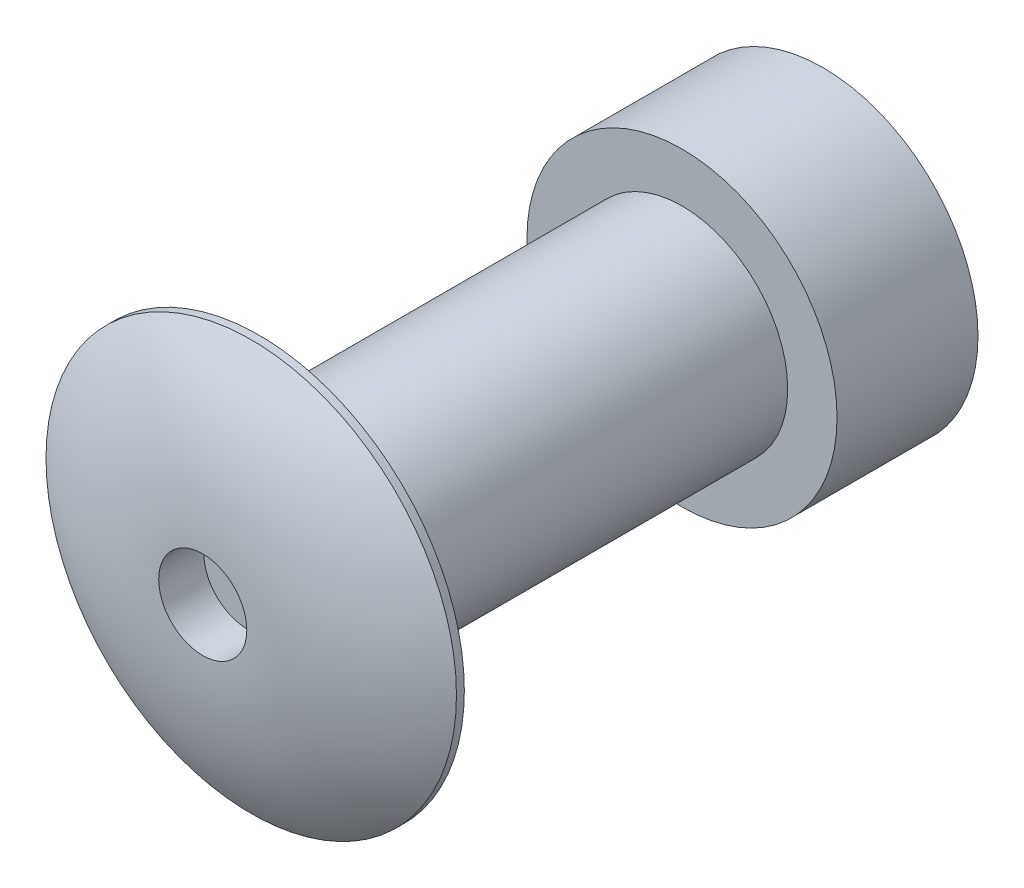
ISO-10303-21;
HEADER;
FILE_DESCRIPTION(('STEP AP214'),'2;1');
FILE_NAME('part.step','',(''),(''),'','','');
FILE_SCHEMA(('AUTOMOTIVE_DESIGN { 1 0 10303 214 1 1 1 1 }'));
ENDSEC;
DATA;
#1=APPLICATION_CONTEXT('core data for automotive mechanical design processes');
#2=APPLICATION_PROTOCOL_DEFINITION('international standard','automotive_design',2000,#1);
#3=PRODUCT_CONTEXT('',#1,'mechanical');
#4=PRODUCT('Part','Part','',(#3));
#5=PRODUCT_RELATED_PRODUCT_CATEGORY('part','',(#4));
#6=PRODUCT_DEFINITION_FORMATION('','',#4);
#7=PRODUCT_DEFINITION_CONTEXT('part definition',#1,'design');
#8=PRODUCT_DEFINITION('design','',#6,#7);
#9=PRODUCT_DEFINITION_SHAPE('','',#8);
#10=(LENGTH_UNIT() NAMED_UNIT(*) SI_UNIT(.MILLI.,.METRE.));
#11=(NAMED_UNIT(*) PLANE_ANGLE_UNIT() SI_UNIT($,.RADIAN.));
#12=(NAMED_UNIT(*) SI_UNIT($,.STERADIAN.) SOLID_ANGLE_UNIT());
#13=UNCERTAINTY_MEASURE_WITH_UNIT(LENGTH_MEASURE(1.E-05),#10,'distance_accuracy_value','');
#14=(GEOMETRIC_REPRESENTATION_CONTEXT(3) GLOBAL_UNCERTAINTY_ASSIGNED_CONTEXT((#13)) GLOBAL_UNIT_ASSIGNED_CONTEXT((#10,
#11,#12)) REPRESENTATION_CONTEXT('',''));
#15=CARTESIAN_POINT('',(0.,0.,0.));
#16=DIRECTION('',(0.,0.,1.));
#17=DIRECTION('',(1.,0.,0.));
#18=AXIS2_PLACEMENT_3D('',#15,#16,#17);
#19=CARTESIAN_POINT('',(0.,3.4925,-12.7));
#20=DIRECTION('',(0.,0.,-1.));
#21=DIRECTION('',(-1.,0.,0.));
#22=AXIS2_PLACEMENT_3D('',#19,#20,#21);
#23=PLANE('',#22);
#24=CARTESIAN_POINT('',(0.,0.,-12.7));
#25=DIRECTION('',(0.,0.,-1.));
#26=DIRECTION('',(-1.,0.,0.));
#27=AXIS2_PLACEMENT_3D('',#24,#25,#26);
#28=CIRCLE('',#27,0.992187500000002);
#29=CARTESIAN_POINT('',(-0.992187500000002,0.,-12.7));
#30=VERTEX_POINT('',#29);
#31=EDGE_CURVE('E70',#30,#30,#28,.T.);
#32=ORIENTED_EDGE('',*,*,#31,.F.);
#33=EDGE_LOOP('',(#32));
#34=FACE_BOUND('',#33,.T.);
#35=CARTESIAN_POINT('',(0.,0.,-12.7));
#36=DIRECTION('',(0.,0.,-1.));
#37=DIRECTION('',(-1.,0.,0.));
#38=AXIS2_PLACEMENT_3D('',#35,#36,#37);
#39=CIRCLE('',#38,3.4925);
#40=CARTESIAN_POINT('',(-3.4925,0.,-12.7));
#41=VERTEX_POINT('',#40);
#42=EDGE_CURVE('E10',#41,#41,#39,.T.);
#43=ORIENTED_EDGE('',*,*,#42,.T.);
#44=EDGE_LOOP('',(#43));
#45=FACE_BOUND('',#44,.T.);
#46=ADVANCED_FACE('F38',(#34,#45),#23,.T.);
#47=CARTESIAN_POINT('',(0.,0.,7.60058061624149));
#48=DIRECTION('',(0.,0.,-1.));
#49=DIRECTION('',(-1.,0.,0.));
#50=AXIS2_PLACEMENT_3D('',#47,#48,#49);
#51=CYLINDRICAL_SURFACE('',#50,3.4925);
#52=CARTESIAN_POINT('',(0.,0.,-9.525));
#53=DIRECTION('',(0.,0.,-1.));
#54=DIRECTION('',(-1.,0.,0.));
#55=AXIS2_PLACEMENT_3D('',#52,#53,#54);
#56=CIRCLE('',#55,3.4925);
#57=CARTESIAN_POINT('',(-3.4925,0.,-9.525));
#58=VERTEX_POINT('',#57);
#59=EDGE_CURVE('E44',#58,#58,#56,.T.);
#60=ORIENTED_EDGE('',*,*,#59,.T.);
#61=EDGE_LOOP('',(#60));
#62=FACE_BOUND('',#61,.T.);
#63=ORIENTED_EDGE('',*,*,#42,.F.);
#64=EDGE_LOOP('',(#63));
#65=FACE_BOUND('',#64,.T.);
#66=ADVANCED_FACE('F86',(#62,#65),#51,.T.);
#67=CARTESIAN_POINT('',(0.,2.38125,-9.525));
#68=DIRECTION('',(0.,0.,1.));
#69=DIRECTION('',(1.,0.,0.));
#70=AXIS2_PLACEMENT_3D('',#67,#68,#69);
#71=PLANE('',#70);
#72=CARTESIAN_POINT('',(0.,0.,-9.525));
#73=DIRECTION('',(0.,0.,-1.));
#74=DIRECTION('',(-1.,0.,0.));
#75=AXIS2_PLACEMENT_3D('',#72,#73,#74);
#76=CIRCLE('',#75,2.38125);
#77=CARTESIAN_POINT('',(-2.38125,0.,-9.525));
#78=VERTEX_POINT('',#77);
#79=EDGE_CURVE('E48',#78,#78,#76,.T.);
#80=ORIENTED_EDGE('',*,*,#79,.T.);
#81=EDGE_LOOP('',(#80));
#82=FACE_BOUND('',#81,.T.);
#83=ORIENTED_EDGE('',*,*,#59,.F.);
#84=EDGE_LOOP('',(#83));
#85=FACE_BOUND('',#84,.T.);
#86=ADVANCED_FACE('F90',(#82,#85),#71,.T.);
#87=CARTESIAN_POINT('',(0.,0.,7.60058061624149));
#88=DIRECTION('',(0.,0.,-1.));
#89=DIRECTION('',(-1.,0.,0.));
#90=AXIS2_PLACEMENT_3D('',#87,#88,#89);
#91=CYLINDRICAL_SURFACE('',#90,2.38125);
#92=CARTESIAN_POINT('',(0.,0.,0.));
#93=DIRECTION('',(0.,0.,-1.));
#94=DIRECTION('',(-1.,0.,0.));
#95=AXIS2_PLACEMENT_3D('',#92,#93,#94);
#96=CIRCLE('',#95,2.38125);
#97=CARTESIAN_POINT('',(-2.38125,0.,0.));
#98=VERTEX_POINT('',#97);
#99=EDGE_CURVE('E52',#98,#98,#96,.T.);
#100=ORIENTED_EDGE('',*,*,#99,.T.);
#101=EDGE_LOOP('',(#100));
#102=FACE_BOUND('',#101,.T.);
#103=ORIENTED_EDGE('',*,*,#79,.F.);
#104=EDGE_LOOP('',(#103));
#105=FACE_BOUND('',#104,.T.);
#106=ADVANCED_FACE('F94',(#102,#105),#91,.T.);
#107=CARTESIAN_POINT('',(0.,2.38125,0.));
#108=DIRECTION('',(0.,0.,-1.));
#109=DIRECTION('',(-1.,0.,0.));
#110=AXIS2_PLACEMENT_3D('',#107,#108,#109);
#111=PLANE('',#110);
#112=CARTESIAN_POINT('',(0.,0.,0.));
#113=DIRECTION('',(0.,0.,-1.));
#114=DIRECTION('',(-1.,0.,0.));
#115=AXIS2_PLACEMENT_3D('',#112,#113,#114);
#116=CIRCLE('',#115,4.6228);
#117=CARTESIAN_POINT('',(-4.6228,0.,0.));
#118=VERTEX_POINT('',#117);
#119=EDGE_CURVE('E57',#118,#118,#116,.T.);
#120=ORIENTED_EDGE('',*,*,#119,.T.);
#121=EDGE_LOOP('',(#120));
#122=FACE_BOUND('',#121,.T.);
#123=ORIENTED_EDGE('',*,*,#99,.F.);
#124=EDGE_LOOP('',(#123));
#125=FACE_BOUND('',#124,.T.);
#126=ADVANCED_FACE('F101',(#122,#125),#111,.T.);
#127=CARTESIAN_POINT('',(0.,0.,7.60058061624149));
#128=DIRECTION('',(0.,0.,-1.));
#129=DIRECTION('',(-1.,0.,0.));
#130=AXIS2_PLACEMENT_3D('',#127,#128,#129);
#131=CYLINDRICAL_SURFACE('',#130,4.6228);
#132=CARTESIAN_POINT('',(0.,0.,0.177799999999999));
#133=DIRECTION('',(0.,0.,-1.));
#134=DIRECTION('',(-1.,0.,0.));
#135=AXIS2_PLACEMENT_3D('',#132,#133,#134);
#136=CIRCLE('',#135,4.6228);
#137=CARTESIAN_POINT('',(-4.6228,0.,0.177799999999999));
#138=VERTEX_POINT('',#137);
#139=EDGE_CURVE('E60',#138,#138,#136,.T.);
#140=ORIENTED_EDGE('',*,*,#139,.T.);
#141=EDGE_LOOP('',(#140));
#142=FACE_BOUND('',#141,.T.);
#143=ORIENTED_EDGE('',*,*,#119,.F.);
#144=EDGE_LOOP('',(#143));
#145=FACE_BOUND('',#144,.T.);
#146=ADVANCED_FACE('F105',(#142,#145),#131,.T.);
#147=CARTESIAN_POINT('',(0.,0.,-5.31041016533429));
#148=DIRECTION('',(0.,0.,-1.));
#149=DIRECTION('',(-1.,0.,0.));
#150=AXIS2_PLACEMENT_3D('',#147,#148,#149);
#151=DEGENERATE_TOROIDAL_SURFACE('',#150,0.992187500000001,6.58041016533429,.T.);
#152=CARTESIAN_POINT('',(0.,0.,1.27));
#153=DIRECTION('',(0.,0.,1.));
#154=DIRECTION('',(1.,0.,0.));
#155=AXIS2_PLACEMENT_3D('',#152,#153,#154);
#156=CIRCLE('',#155,0.992187500000002);
#157=CARTESIAN_POINT('',(0.992187500000002,0.,1.27));
#158=VERTEX_POINT('',#157);
#159=EDGE_CURVE('E64',#158,#158,#156,.T.);
#160=ORIENTED_EDGE('',*,*,#159,.F.);
#161=EDGE_LOOP('',(#160));
#162=FACE_BOUND('',#161,.T.);
#163=ORIENTED_EDGE('',*,*,#139,.F.);
#164=EDGE_LOOP('',(#163));
#165=FACE_BOUND('',#164,.T.);
#166=ADVANCED_FACE('F109',(#162,#165),#151,.T.);
#167=CARTESIAN_POINT('',(0.,0.,0.254));
#168=DIRECTION('',(0.,0.,1.));
#169=DIRECTION('',(1.,0.,0.));
#170=AXIS2_PLACEMENT_3D('',#167,#168,#169);
#171=CYLINDRICAL_SURFACE('',#170,0.992187500000002);
#172=CARTESIAN_POINT('',(0.,0.,0.254));
#173=DIRECTION('',(0.,0.,1.));
#174=DIRECTION('',(1.,0.,0.));
#175=AXIS2_PLACEMENT_3D('',#172,#173,#174);
#176=CIRCLE('',#175,0.992187500000002);
#177=CARTESIAN_POINT('',(0.992187500000002,0.,0.254));
#178=VERTEX_POINT('',#177);
#179=EDGE_CURVE('E63',#178,#178,#176,.T.);
#180=ORIENTED_EDGE('',*,*,#179,.F.);
#181=EDGE_LOOP('',(#180));
#182=FACE_BOUND('',#181,.T.);
#183=ORIENTED_EDGE('',*,*,#159,.T.);
#184=EDGE_LOOP('',(#183));
#185=FACE_BOUND('',#184,.T.);
#186=ADVANCED_FACE('F113',(#182,#185),#171,.F.);
#187=CARTESIAN_POINT('',(0.,0.,0.254));
#188=DIRECTION('',(0.,0.,1.));
#189=DIRECTION('',(1.,0.,0.));
#190=AXIS2_PLACEMENT_3D('',#187,#188,#189);
#191=PLANE('',#190);
#192=ORIENTED_EDGE('',*,*,#179,.T.);
#193=EDGE_LOOP('',(#192));
#194=FACE_BOUND('',#193,.T.);
#195=ADVANCED_FACE('F81',(#194),#191,.T.);
#196=CARTESIAN_POINT('',(0.,0.,-10.16));
#197=DIRECTION('',(0.,0.,-1.));
#198=DIRECTION('',(-1.,0.,0.));
#199=AXIS2_PLACEMENT_3D('',#196,#197,#198);
#200=CYLINDRICAL_SURFACE('',#199,0.992187500000002);
#201=CARTESIAN_POINT('',(0.,0.,-10.16));
#202=DIRECTION('',(0.,0.,-1.));
#203=DIRECTION('',(-1.,0.,0.));
#204=AXIS2_PLACEMENT_3D('',#201,#202,#203);
#205=CIRCLE('',#204,0.992187500000002);
#206=CARTESIAN_POINT('',(-0.992187500000002,0.,-10.16));
#207=VERTEX_POINT('',#206);
#208=EDGE_CURVE('E67',#207,#207,#205,.T.);
#209=ORIENTED_EDGE('',*,*,#208,.F.);
#210=EDGE_LOOP('',(#209));
#211=FACE_BOUND('',#210,.T.);
#212=ORIENTED_EDGE('',*,*,#31,.T.);
#213=EDGE_LOOP('',(#212));
#214=FACE_BOUND('',#213,.T.);
#215=ADVANCED_FACE('F78',(#211,#214),#200,.F.);
#216=CARTESIAN_POINT('',(0.,0.,-10.16));
#217=DIRECTION('',(0.,0.,-1.));
#218=DIRECTION('',(-1.,0.,0.));
#219=AXIS2_PLACEMENT_3D('',#216,#217,#218);
#220=PLANE('',#219);
#221=ORIENTED_EDGE('',*,*,#208,.T.);
#222=EDGE_LOOP('',(#221));
#223=FACE_BOUND('',#222,.T.);
#224=ADVANCED_FACE('F76',(#223),#220,.T.);
#225=CLOSED_SHELL('',(#46,#66,#86,#106,#126,#146,#166,#186,#195,#215,#224));
#226=MANIFOLD_SOLID_BREP('B2',#225);
#227=ADVANCED_BREP_SHAPE_REPRESENTATION('',(#18,#226),#14);
#228=SHAPE_DEFINITION_REPRESENTATION(#9,#227);
ENDSEC;
END-ISO-10303-21;
